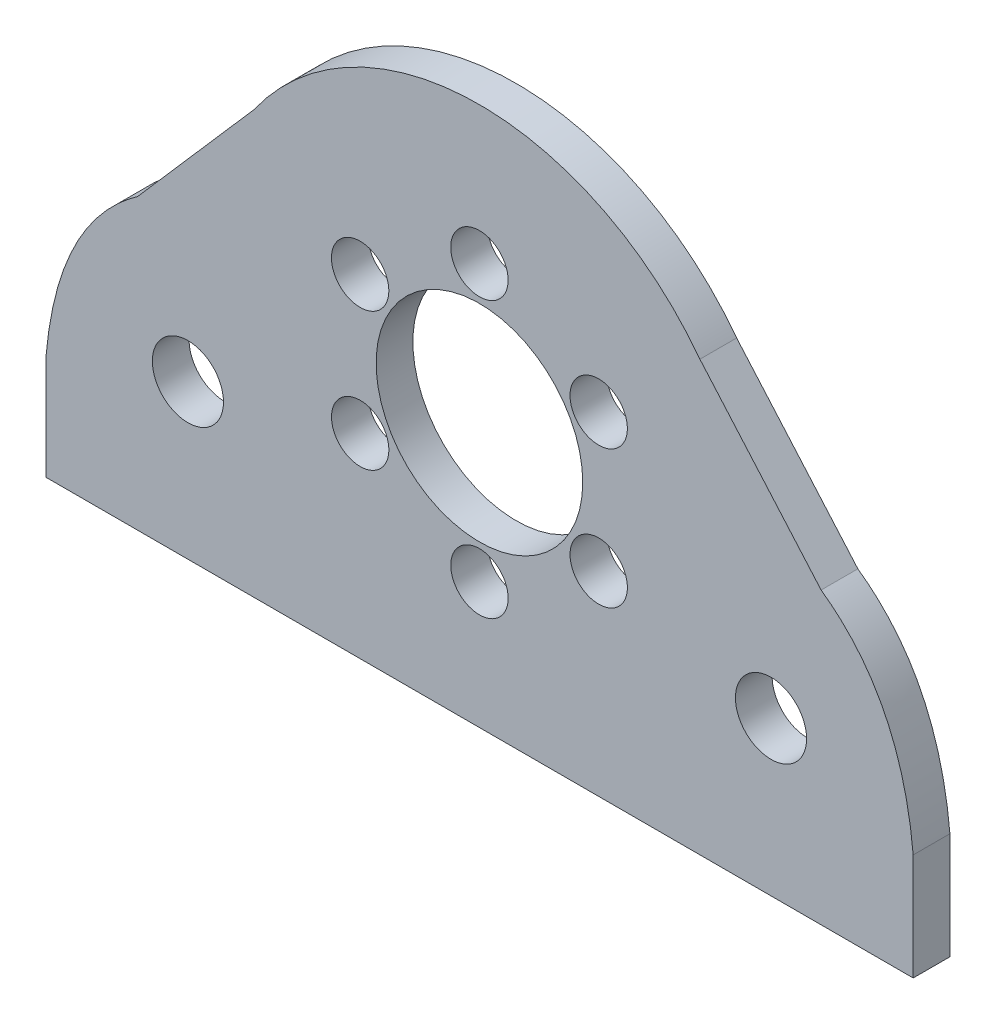
ISO-10303-21;
HEADER;
FILE_DESCRIPTION(('STEP AP214'),'2;1');
FILE_NAME('part.step','',(''),(''),'','','');
FILE_SCHEMA(('AUTOMOTIVE_DESIGN { 1 0 10303 214 1 1 1 1 }'));
ENDSEC;
DATA;
#1=APPLICATION_CONTEXT('core data for automotive mechanical design processes');
#2=APPLICATION_PROTOCOL_DEFINITION('international standard','automotive_design',2000,#1);
#3=PRODUCT_CONTEXT('',#1,'mechanical');
#4=PRODUCT('Part','Part','',(#3));
#5=PRODUCT_RELATED_PRODUCT_CATEGORY('part','',(#4));
#6=PRODUCT_DEFINITION_FORMATION('','',#4);
#7=PRODUCT_DEFINITION_CONTEXT('part definition',#1,'design');
#8=PRODUCT_DEFINITION('design','',#6,#7);
#9=PRODUCT_DEFINITION_SHAPE('','',#8);
#10=(LENGTH_UNIT() NAMED_UNIT(*) SI_UNIT(.MILLI.,.METRE.));
#11=(NAMED_UNIT(*) PLANE_ANGLE_UNIT() SI_UNIT($,.RADIAN.));
#12=(NAMED_UNIT(*) SI_UNIT($,.STERADIAN.) SOLID_ANGLE_UNIT());
#13=UNCERTAINTY_MEASURE_WITH_UNIT(LENGTH_MEASURE(1.E-05),#10,'distance_accuracy_value','');
#14=(GEOMETRIC_REPRESENTATION_CONTEXT(3) GLOBAL_UNCERTAINTY_ASSIGNED_CONTEXT((#13)) GLOBAL_UNIT_ASSIGNED_CONTEXT((#10,
#11,#12)) REPRESENTATION_CONTEXT('',''));
#15=CARTESIAN_POINT('',(0.,0.,0.));
#16=DIRECTION('',(0.,0.,1.));
#17=DIRECTION('',(1.,0.,0.));
#18=AXIS2_PLACEMENT_3D('',#15,#16,#17);
#19=CARTESIAN_POINT('',(18.8920534724066,0.,1.6));
#20=DIRECTION('',(-1.,0.,0.));
#21=DIRECTION('',(0.,0.,1.));
#22=AXIS2_PLACEMENT_3D('',#19,#20,#21);
#23=PLANE('',#22);
#24=DIRECTION('',(0.,1.,0.));
#25=VECTOR('',#24,1.);
#26=CARTESIAN_POINT('',(18.8920534724066,0.,0.));
#27=LINE('',#26,#25);
#28=CARTESIAN_POINT('',(18.8920534724066,-10.5537900070468,0.));
#29=VERTEX_POINT('',#28);
#30=CARTESIAN_POINT('',(18.8920534724066,-5.91094568571899,0.));
#31=VERTEX_POINT('',#30);
#32=EDGE_CURVE('E180',#29,#31,#27,.T.);
#33=ORIENTED_EDGE('',*,*,#32,.T.);
#34=DIRECTION('',(0.,0.,-1.));
#35=VECTOR('',#34,1.);
#36=CARTESIAN_POINT('',(18.8920534724066,-5.91094568571899,1.6));
#37=LINE('',#36,#35);
#38=CARTESIAN_POINT('',(18.8920534724066,-5.91094568571899,1.6));
#39=VERTEX_POINT('',#38);
#40=EDGE_CURVE('E11',#39,#31,#37,.T.);
#41=ORIENTED_EDGE('',*,*,#40,.F.);
#42=DIRECTION('',(0.,1.,0.));
#43=VECTOR('',#42,1.);
#44=CARTESIAN_POINT('',(18.8920534724066,0.,1.6));
#45=LINE('',#44,#43);
#46=CARTESIAN_POINT('',(18.8920534724066,-10.5537900070468,1.6));
#47=VERTEX_POINT('',#46);
#48=EDGE_CURVE('E257',#47,#39,#45,.T.);
#49=ORIENTED_EDGE('',*,*,#48,.F.);
#50=DIRECTION('',(0.,0.,-1.));
#51=VECTOR('',#50,1.);
#52=CARTESIAN_POINT('',(18.8920534724066,-10.5537900070468,1.6));
#53=LINE('',#52,#51);
#54=EDGE_CURVE('E137',#47,#29,#53,.T.);
#55=ORIENTED_EDGE('',*,*,#54,.T.);
#56=EDGE_LOOP('',(#33,#41,#49,#55));
#57=FACE_BOUND('',#56,.T.);
#58=ADVANCED_FACE('F41',(#57),#23,.F.);
#59=CARTESIAN_POINT('',(18.8920534724066,-5.91094568571899,1.6));
#60=CARTESIAN_POINT('',(18.3783475875311,-0.392416565991136,1.6));
#61=CARTESIAN_POINT('',(14.881416044763,2.07387919766717,1.6));
#62=B_SPLINE_CURVE_WITH_KNOTS('',2,(#59,#60,#61),.UNSPECIFIED.,.F.,.F.,(3,3),(0.,
0.73409738211768),.UNSPECIFIED.);
#63=DIRECTION('',(0.,0.,-1.));
#64=VECTOR('',#63,1.);
#65=SURFACE_OF_LINEAR_EXTRUSION('',#62,#64);
#66=CARTESIAN_POINT('',(18.8920534724066,-5.91094568571899,0.));
#67=CARTESIAN_POINT('',(18.3783475875311,-0.392416565991136,0.));
#68=CARTESIAN_POINT('',(14.881416044763,2.07387919766717,0.));
#69=B_SPLINE_CURVE_WITH_KNOTS('',2,(#66,#67,#68),.UNSPECIFIED.,.F.,.F.,(3,3),(0.,
0.73409738211768),.UNSPECIFIED.);
#70=CARTESIAN_POINT('',(14.881416044763,2.07387919766717,0.));
#71=VERTEX_POINT('',#70);
#72=EDGE_CURVE('E184',#31,#71,#69,.T.);
#73=ORIENTED_EDGE('',*,*,#72,.T.);
#74=DIRECTION('',(0.,0.,-1.));
#75=VECTOR('',#74,1.);
#76=CARTESIAN_POINT('',(14.881416044763,2.07387919766717,1.6));
#77=LINE('',#76,#75);
#78=CARTESIAN_POINT('',(14.881416044763,2.07387919766717,1.6));
#79=VERTEX_POINT('',#78);
#80=EDGE_CURVE('E51',#79,#71,#77,.T.);
#81=ORIENTED_EDGE('',*,*,#80,.F.);
#82=EDGE_CURVE('E98',#39,#79,#62,.T.);
#83=ORIENTED_EDGE('',*,*,#82,.F.);
#84=ORIENTED_EDGE('',*,*,#40,.T.);
#85=EDGE_LOOP('',(#73,#81,#83,#84));
#86=FACE_BOUND('',#85,.T.);
#87=ADVANCED_FACE('F263',(#86),#65,.F.);
#88=CARTESIAN_POINT('',(9.49702637729896,8.26265301891822,1.6));
#89=DIRECTION('',(-0.754433634744684,-0.65637633318541,0.));
#90=DIRECTION('',(0.65637633318541,-0.754433634744684,0.));
#91=AXIS2_PLACEMENT_3D('',#88,#89,#90);
#92=PLANE('',#91);
#93=DIRECTION('',(-0.65637633318541,0.754433634744684,0.));
#94=VECTOR('',#93,1.);
#95=CARTESIAN_POINT('',(9.49702637729896,8.26265301891822,0.));
#96=LINE('',#95,#94);
#97=CARTESIAN_POINT('',(9.6016983628083,8.14234388756896,0.));
#98=VERTEX_POINT('',#97);
#99=EDGE_CURVE('E189',#71,#98,#96,.T.);
#100=ORIENTED_EDGE('',*,*,#99,.T.);
#101=DIRECTION('',(0.,0.,-1.));
#102=VECTOR('',#101,1.);
#103=CARTESIAN_POINT('',(9.6016983628083,8.14234388756896,1.6));
#104=LINE('',#103,#102);
#105=CARTESIAN_POINT('',(9.6016983628083,8.14234388756896,1.6));
#106=VERTEX_POINT('',#105);
#107=EDGE_CURVE('E225',#106,#98,#104,.T.);
#108=ORIENTED_EDGE('',*,*,#107,.F.);
#109=DIRECTION('',(-0.65637633318541,0.754433634744684,0.));
#110=VECTOR('',#109,1.);
#111=CARTESIAN_POINT('',(9.49702637729896,8.26265301891822,1.6));
#112=LINE('',#111,#110);
#113=EDGE_CURVE('E235',#79,#106,#112,.T.);
#114=ORIENTED_EDGE('',*,*,#113,.F.);
#115=ORIENTED_EDGE('',*,*,#80,.T.);
#116=EDGE_LOOP('',(#100,#108,#114,#115));
#117=FACE_BOUND('',#116,.T.);
#118=ADVANCED_FACE('F233',(#117),#92,.F.);
#119=CARTESIAN_POINT('',(-0.00120000000012124,0.94620999251001,1.6));
#120=DIRECTION('',(0.,0.,-1.));
#121=DIRECTION('',(-1.,0.,0.));
#122=AXIS2_PLACEMENT_3D('',#119,#120,#121);
#123=CYLINDRICAL_SURFACE('',#122,12.0000000000852);
#124=CARTESIAN_POINT('',(-0.00120000000012124,0.94620999251001,0.));
#125=DIRECTION('',(0.,0.,1.));
#126=DIRECTION('',(1.,0.,0.));
#127=AXIS2_PLACEMENT_3D('',#124,#125,#126);
#128=CIRCLE('',#127,12.0000000000852);
#129=CARTESIAN_POINT('',(-9.81679273195231,7.84940775314908,0.));
#130=VERTEX_POINT('',#129);
#131=EDGE_CURVE('E195',#98,#130,#128,.T.);
#132=ORIENTED_EDGE('',*,*,#131,.T.);
#133=DIRECTION('',(0.,0.,-1.));
#134=VECTOR('',#133,1.);
#135=CARTESIAN_POINT('',(-9.81679273195231,7.84940775314908,1.6));
#136=LINE('',#135,#134);
#137=CARTESIAN_POINT('',(-9.81679273195231,7.84940775314908,1.6));
#138=VERTEX_POINT('',#137);
#139=EDGE_CURVE('E222',#138,#130,#136,.T.);
#140=ORIENTED_EDGE('',*,*,#139,.F.);
#141=CARTESIAN_POINT('',(-0.00120000000012124,0.94620999251001,1.6));
#142=DIRECTION('',(0.,0.,1.));
#143=DIRECTION('',(1.,0.,0.));
#144=AXIS2_PLACEMENT_3D('',#141,#142,#143);
#145=CIRCLE('',#144,12.0000000000852);
#146=EDGE_CURVE('E245',#106,#138,#145,.T.);
#147=ORIENTED_EDGE('',*,*,#146,.F.);
#148=ORIENTED_EDGE('',*,*,#107,.T.);
#149=EDGE_LOOP('',(#132,#140,#147,#148));
#150=FACE_BOUND('',#149,.T.);
#151=ADVANCED_FACE('F243',(#150),#123,.T.);
#152=CARTESIAN_POINT('',(-9.46412899404464,8.25378641515928,1.6));
#153=DIRECTION('',(-0.753654096461741,0.657271255180413,0.));
#154=DIRECTION('',(-0.657271255180413,-0.753654096461741,0.));
#155=AXIS2_PLACEMENT_3D('',#152,#153,#154);
#156=PLANE('',#155);
#157=DIRECTION('',(0.657271255180413,0.753654096461741,0.));
#158=VECTOR('',#157,1.);
#159=CARTESIAN_POINT('',(-9.46412899404464,8.25378641515928,0.));
#160=LINE('',#159,#158);
#161=CARTESIAN_POINT('',(-14.8866284260427,2.03612684496389,0.));
#162=VERTEX_POINT('',#161);
#163=EDGE_CURVE('E199',#162,#130,#160,.T.);
#164=ORIENTED_EDGE('',*,*,#163,.F.);
#165=DIRECTION('',(0.,0.,-1.));
#166=VECTOR('',#165,1.);
#167=CARTESIAN_POINT('',(-14.8866284260427,2.03612684496389,1.6));
#168=LINE('',#167,#166);
#169=CARTESIAN_POINT('',(-14.8866284260427,2.03612684496389,1.6));
#170=VERTEX_POINT('',#169);
#171=EDGE_CURVE('E124',#170,#162,#168,.T.);
#172=ORIENTED_EDGE('',*,*,#171,.F.);
#173=DIRECTION('',(0.657271255180413,0.753654096461741,0.));
#174=VECTOR('',#173,1.);
#175=CARTESIAN_POINT('',(-9.46412899404464,8.25378641515928,1.6));
#176=LINE('',#175,#174);
#177=EDGE_CURVE('E130',#170,#138,#176,.T.);
#178=ORIENTED_EDGE('',*,*,#177,.T.);
#179=ORIENTED_EDGE('',*,*,#139,.T.);
#180=EDGE_LOOP('',(#164,#172,#178,#179));
#181=FACE_BOUND('',#180,.T.);
#182=ADVANCED_FACE('F349',(#181),#156,.T.);
#183=CARTESIAN_POINT('',(-18.8769999969561,-5.95884505745107,1.6));
#184=CARTESIAN_POINT('',(-18.3772931316078,-0.43903071001476,1.6));
#185=CARTESIAN_POINT('',(-14.8866284260427,2.03612684496389,1.6));
#186=B_SPLINE_CURVE_WITH_KNOTS('',2,(#183,#184,#185),.UNSPECIFIED.,.F.,.F.,(3,3),(0.,
0.73409738211768),.UNSPECIFIED.);
#187=DIRECTION('',(0.,0.,-1.));
#188=VECTOR('',#187,1.);
#189=SURFACE_OF_LINEAR_EXTRUSION('',#186,#188);
#190=CARTESIAN_POINT('',(-18.8769999969561,-5.95884505745107,0.));
#191=CARTESIAN_POINT('',(-18.3772931316078,-0.43903071001476,0.));
#192=CARTESIAN_POINT('',(-14.8866284260427,2.03612684496389,0.));
#193=B_SPLINE_CURVE_WITH_KNOTS('',2,(#190,#191,#192),.UNSPECIFIED.,.F.,.F.,(3,3),(0.,
0.73409738211768),.UNSPECIFIED.);
#194=CARTESIAN_POINT('',(-18.8769999969561,-5.95884505745107,0.));
#195=VERTEX_POINT('',#194);
#196=EDGE_CURVE('E118',#195,#162,#193,.T.);
#197=ORIENTED_EDGE('',*,*,#196,.F.);
#198=DIRECTION('',(0.,0.,-1.));
#199=VECTOR('',#198,1.);
#200=CARTESIAN_POINT('',(-18.8769999969561,-5.95884505745107,1.6));
#201=LINE('',#200,#199);
#202=CARTESIAN_POINT('',(-18.8769999969561,-5.95884505745107,1.6));
#203=VERTEX_POINT('',#202);
#204=EDGE_CURVE('E113',#203,#195,#201,.T.);
#205=ORIENTED_EDGE('',*,*,#204,.F.);
#206=EDGE_CURVE('E116',#203,#170,#186,.T.);
#207=ORIENTED_EDGE('',*,*,#206,.T.);
#208=ORIENTED_EDGE('',*,*,#171,.T.);
#209=EDGE_LOOP('',(#197,#205,#207,#208));
#210=FACE_BOUND('',#209,.T.);
#211=ADVANCED_FACE('F115',(#210),#189,.T.);
#212=CARTESIAN_POINT('',(-18.8769999969561,0.,1.6));
#213=DIRECTION('',(-1.,0.,0.));
#214=DIRECTION('',(0.,0.,1.));
#215=AXIS2_PLACEMENT_3D('',#212,#213,#214);
#216=PLANE('',#215);
#217=DIRECTION('',(0.,1.,0.));
#218=VECTOR('',#217,1.);
#219=CARTESIAN_POINT('',(-18.8769999969561,0.,0.));
#220=LINE('',#219,#218);
#221=CARTESIAN_POINT('',(-18.8769999969561,-10.5537900070468,0.));
#222=VERTEX_POINT('',#221);
#223=EDGE_CURVE('E207',#222,#195,#220,.T.);
#224=ORIENTED_EDGE('',*,*,#223,.F.);
#225=DIRECTION('',(0.,0.,-1.));
#226=VECTOR('',#225,1.);
#227=CARTESIAN_POINT('',(-18.8769999969561,-10.5537900070468,1.6));
#228=LINE('',#227,#226);
#229=CARTESIAN_POINT('',(-18.8769999969561,-10.5537900070468,1.6));
#230=VERTEX_POINT('',#229);
#231=EDGE_CURVE('E87',#230,#222,#228,.T.);
#232=ORIENTED_EDGE('',*,*,#231,.F.);
#233=DIRECTION('',(0.,1.,0.));
#234=VECTOR('',#233,1.);
#235=CARTESIAN_POINT('',(-18.8769999969561,0.,1.6));
#236=LINE('',#235,#234);
#237=EDGE_CURVE('E128',#230,#203,#236,.T.);
#238=ORIENTED_EDGE('',*,*,#237,.T.);
#239=ORIENTED_EDGE('',*,*,#204,.T.);
#240=EDGE_LOOP('',(#224,#232,#238,#239));
#241=FACE_BOUND('',#240,.T.);
#242=ADVANCED_FACE('F133',(#241),#216,.T.);
#243=CARTESIAN_POINT('',(-0.00120000000012124,0.94620999251001,1.6));
#244=DIRECTION('',(0.,0.,-1.));
#245=DIRECTION('',(-1.,0.,0.));
#246=AXIS2_PLACEMENT_3D('',#243,#244,#245);
#247=CYLINDRICAL_SURFACE('',#246,4.50000000012904);
#248=CARTESIAN_POINT('',(-0.00120000000012124,0.94620999251001,1.6));
#249=DIRECTION('',(0.,0.,1.));
#250=DIRECTION('',(1.,0.,0.));
#251=AXIS2_PLACEMENT_3D('',#248,#249,#250);
#252=CIRCLE('',#251,4.50000000012904);
#253=CARTESIAN_POINT('',(4.49880000012892,0.94620999251001,1.6));
#254=VERTEX_POINT('',#253);
#255=EDGE_CURVE('E467',#254,#254,#252,.T.);
#256=ORIENTED_EDGE('',*,*,#255,.T.);
#257=EDGE_LOOP('',(#256));
#258=FACE_BOUND('',#257,.T.);
#259=CARTESIAN_POINT('',(-0.00120000000012124,0.94620999251001,0.));
#260=DIRECTION('',(0.,0.,1.));
#261=DIRECTION('',(1.,0.,0.));
#262=AXIS2_PLACEMENT_3D('',#259,#260,#261);
#263=CIRCLE('',#262,4.50000000012904);
#264=CARTESIAN_POINT('',(4.49880000012892,0.94620999251001,0.));
#265=VERTEX_POINT('',#264);
#266=EDGE_CURVE('E176',#265,#265,#263,.T.);
#267=ORIENTED_EDGE('',*,*,#266,.F.);
#268=EDGE_LOOP('',(#267));
#269=FACE_BOUND('',#268,.T.);
#270=ADVANCED_FACE('F271',(#258,#269),#247,.F.);
#271=CARTESIAN_POINT('',(-0.00239999997024294,6.94501000288142,1.6));
#272=DIRECTION('',(0.,0.,-1.));
#273=DIRECTION('',(-1.,0.,0.));
#274=AXIS2_PLACEMENT_3D('',#271,#272,#273);
#275=CYLINDRICAL_SURFACE('',#274,1.24999999706816);
#276=CARTESIAN_POINT('',(-0.00239999997024294,6.94501000288142,1.6));
#277=DIRECTION('',(0.,0.,1.));
#278=DIRECTION('',(1.,0.,0.));
#279=AXIS2_PLACEMENT_3D('',#276,#277,#278);
#280=CIRCLE('',#279,1.24999999706816);
#281=CARTESIAN_POINT('',(1.24759999709792,6.94501000288142,1.6));
#282=VERTEX_POINT('',#281);
#283=EDGE_CURVE('E470',#282,#282,#280,.T.);
#284=ORIENTED_EDGE('',*,*,#283,.T.);
#285=EDGE_LOOP('',(#284));
#286=FACE_BOUND('',#285,.T.);
#287=CARTESIAN_POINT('',(-0.00239999997024294,6.94501000288142,0.));
#288=DIRECTION('',(0.,0.,1.));
#289=DIRECTION('',(1.,0.,0.));
#290=AXIS2_PLACEMENT_3D('',#287,#288,#289);
#291=CIRCLE('',#290,1.24999999706816);
#292=CARTESIAN_POINT('',(1.24759999709792,6.94501000288142,0.));
#293=VERTEX_POINT('',#292);
#294=EDGE_CURVE('E172',#293,#293,#291,.T.);
#295=ORIENTED_EDGE('',*,*,#294,.F.);
#296=EDGE_LOOP('',(#295));
#297=FACE_BOUND('',#296,.T.);
#298=ADVANCED_FACE('F274',(#286,#297),#275,.F.);
#299=CARTESIAN_POINT('',(5.19331319222158,3.94664922343804,1.6));
#300=DIRECTION('',(0.,0.,-1.));
#301=DIRECTION('',(-1.,0.,0.));
#302=AXIS2_PLACEMENT_3D('',#299,#300,#301);
#303=CYLINDRICAL_SURFACE('',#302,1.25000000000009);
#304=CARTESIAN_POINT('',(5.19331319222158,3.94664922343804,1.6));
#305=DIRECTION('',(0.,0.,1.));
#306=DIRECTION('',(1.,0.,0.));
#307=AXIS2_PLACEMENT_3D('',#304,#305,#306);
#308=CIRCLE('',#307,1.25000000000009);
#309=CARTESIAN_POINT('',(6.44331319222167,3.94664922343804,1.6));
#310=VERTEX_POINT('',#309);
#311=EDGE_CURVE('E474',#310,#310,#308,.T.);
#312=ORIENTED_EDGE('',*,*,#311,.T.);
#313=EDGE_LOOP('',(#312));
#314=FACE_BOUND('',#313,.T.);
#315=CARTESIAN_POINT('',(5.19331319222158,3.94664922343804,0.));
#316=DIRECTION('',(0.,0.,1.));
#317=DIRECTION('',(1.,0.,0.));
#318=AXIS2_PLACEMENT_3D('',#315,#316,#317);
#319=CIRCLE('',#318,1.25000000000009);
#320=CARTESIAN_POINT('',(6.44331319222167,3.94664922343804,0.));
#321=VERTEX_POINT('',#320);
#322=EDGE_CURVE('E168',#321,#321,#319,.T.);
#323=ORIENTED_EDGE('',*,*,#322,.F.);
#324=EDGE_LOOP('',(#323));
#325=FACE_BOUND('',#324,.T.);
#326=ADVANCED_FACE('F278',(#314,#325),#303,.F.);
#327=CARTESIAN_POINT('',(5.19451319222192,-2.05215077656196,1.6));
#328=DIRECTION('',(0.,0.,-1.));
#329=DIRECTION('',(-1.,0.,0.));
#330=AXIS2_PLACEMENT_3D('',#327,#328,#329);
#331=CYLINDRICAL_SURFACE('',#330,1.25000000000043);
#332=CARTESIAN_POINT('',(5.19451319222192,-2.05215077656196,1.6));
#333=DIRECTION('',(0.,0.,1.));
#334=DIRECTION('',(1.,0.,0.));
#335=AXIS2_PLACEMENT_3D('',#332,#333,#334);
#336=CIRCLE('',#335,1.25000000000043);
#337=CARTESIAN_POINT('',(6.44451319222235,-2.05215077656196,1.6));
#338=VERTEX_POINT('',#337);
#339=EDGE_CURVE('E480',#338,#338,#336,.T.);
#340=ORIENTED_EDGE('',*,*,#339,.T.);
#341=EDGE_LOOP('',(#340));
#342=FACE_BOUND('',#341,.T.);
#343=CARTESIAN_POINT('',(5.19451319222192,-2.05215077656196,0.));
#344=DIRECTION('',(0.,0.,1.));
#345=DIRECTION('',(1.,0.,0.));
#346=AXIS2_PLACEMENT_3D('',#343,#344,#345);
#347=CIRCLE('',#346,1.25000000000043);
#348=CARTESIAN_POINT('',(6.44451319222235,-2.05215077656196,0.));
#349=VERTEX_POINT('',#348);
#350=EDGE_CURVE('E164',#349,#349,#347,.T.);
#351=ORIENTED_EDGE('',*,*,#350,.F.);
#352=EDGE_LOOP('',(#351));
#353=FACE_BOUND('',#352,.T.);
#354=ADVANCED_FACE('F282',(#342,#353),#331,.F.);
#355=CARTESIAN_POINT('',(0.,-5.0525900070468,1.6));
#356=DIRECTION('',(0.,0.,-1.));
#357=DIRECTION('',(-1.,0.,0.));
#358=AXIS2_PLACEMENT_3D('',#355,#356,#357);
#359=CYLINDRICAL_SURFACE('',#358,1.25000000000069);
#360=CARTESIAN_POINT('',(0.,-5.0525900070468,1.6));
#361=DIRECTION('',(0.,0.,1.));
#362=DIRECTION('',(1.,0.,0.));
#363=AXIS2_PLACEMENT_3D('',#360,#361,#362);
#364=CIRCLE('',#363,1.25000000000069);
#365=CARTESIAN_POINT('',(1.25000000000069,-5.0525900070468,1.6));
#366=VERTEX_POINT('',#365);
#367=EDGE_CURVE('E484',#366,#366,#364,.T.);
#368=ORIENTED_EDGE('',*,*,#367,.T.);
#369=EDGE_LOOP('',(#368));
#370=FACE_BOUND('',#369,.T.);
#371=CARTESIAN_POINT('',(0.,-5.0525900070468,0.));
#372=DIRECTION('',(0.,0.,1.));
#373=DIRECTION('',(1.,0.,0.));
#374=AXIS2_PLACEMENT_3D('',#371,#372,#373);
#375=CIRCLE('',#374,1.25000000000069);
#376=CARTESIAN_POINT('',(1.25000000000069,-5.0525900070468,0.));
#377=VERTEX_POINT('',#376);
#378=EDGE_CURVE('E160',#377,#377,#375,.T.);
#379=ORIENTED_EDGE('',*,*,#378,.F.);
#380=EDGE_LOOP('',(#379));
#381=FACE_BOUND('',#380,.T.);
#382=ADVANCED_FACE('F286',(#370,#381),#359,.F.);
#383=CARTESIAN_POINT('',(-5.19571319222226,-2.05422923753164,1.6));
#384=DIRECTION('',(0.,0.,-1.));
#385=DIRECTION('',(-1.,0.,0.));
#386=AXIS2_PLACEMENT_3D('',#383,#384,#385);
#387=CYLINDRICAL_SURFACE('',#386,1.25000000000063);
#388=CARTESIAN_POINT('',(-5.19571319222226,-2.05422923753164,1.6));
#389=DIRECTION('',(0.,0.,1.));
#390=DIRECTION('',(1.,0.,0.));
#391=AXIS2_PLACEMENT_3D('',#388,#389,#390);
#392=CIRCLE('',#391,1.25000000000063);
#393=CARTESIAN_POINT('',(-3.94571319222163,-2.05422923753164,1.6));
#394=VERTEX_POINT('',#393);
#395=EDGE_CURVE('E488',#394,#394,#392,.T.);
#396=ORIENTED_EDGE('',*,*,#395,.T.);
#397=EDGE_LOOP('',(#396));
#398=FACE_BOUND('',#397,.T.);
#399=CARTESIAN_POINT('',(-5.19571319222226,-2.05422923753164,0.));
#400=DIRECTION('',(0.,0.,1.));
#401=DIRECTION('',(1.,0.,0.));
#402=AXIS2_PLACEMENT_3D('',#399,#400,#401);
#403=CIRCLE('',#402,1.25000000000063);
#404=CARTESIAN_POINT('',(-3.94571319222163,-2.05422923753164,0.));
#405=VERTEX_POINT('',#404);
#406=EDGE_CURVE('E156',#405,#405,#403,.T.);
#407=ORIENTED_EDGE('',*,*,#406,.F.);
#408=EDGE_LOOP('',(#407));
#409=FACE_BOUND('',#408,.T.);
#410=ADVANCED_FACE('F290',(#398,#409),#387,.F.);
#411=CARTESIAN_POINT('',(-5.19691324784471,3.94457079457472,1.6));
#412=DIRECTION('',(0.,0.,-1.));
#413=DIRECTION('',(-1.,0.,0.));
#414=AXIS2_PLACEMENT_3D('',#411,#412,#413);
#415=CYLINDRICAL_SURFACE('',#414,1.25000000660969);
#416=CARTESIAN_POINT('',(-5.19691324784471,3.94457079457472,1.6));
#417=DIRECTION('',(0.,0.,1.));
#418=DIRECTION('',(1.,0.,0.));
#419=AXIS2_PLACEMENT_3D('',#416,#417,#418);
#420=CIRCLE('',#419,1.25000000660969);
#421=CARTESIAN_POINT('',(-3.94691324123502,3.94457079457472,1.6));
#422=VERTEX_POINT('',#421);
#423=EDGE_CURVE('E492',#422,#422,#420,.T.);
#424=ORIENTED_EDGE('',*,*,#423,.T.);
#425=EDGE_LOOP('',(#424));
#426=FACE_BOUND('',#425,.T.);
#427=CARTESIAN_POINT('',(-5.19691324784471,3.94457079457472,0.));
#428=DIRECTION('',(0.,0.,1.));
#429=DIRECTION('',(1.,0.,0.));
#430=AXIS2_PLACEMENT_3D('',#427,#428,#429);
#431=CIRCLE('',#430,1.25000000660969);
#432=CARTESIAN_POINT('',(-3.94691324123502,3.94457079457472,0.));
#433=VERTEX_POINT('',#432);
#434=EDGE_CURVE('E152',#433,#433,#431,.T.);
#435=ORIENTED_EDGE('',*,*,#434,.F.);
#436=EDGE_LOOP('',(#435));
#437=FACE_BOUND('',#436,.T.);
#438=ADVANCED_FACE('F294',(#426,#437),#415,.F.);
#439=CARTESIAN_POINT('',(12.6987999999993,-3.8537900070468,1.6));
#440=DIRECTION('',(0.,0.,-1.));
#441=DIRECTION('',(-1.,0.,0.));
#442=AXIS2_PLACEMENT_3D('',#439,#440,#441);
#443=CYLINDRICAL_SURFACE('',#442,1.55);
#444=CARTESIAN_POINT('',(12.6987999999993,-3.8537900070468,1.6));
#445=DIRECTION('',(0.,0.,1.));
#446=DIRECTION('',(1.,0.,0.));
#447=AXIS2_PLACEMENT_3D('',#444,#445,#446);
#448=CIRCLE('',#447,1.55);
#449=CARTESIAN_POINT('',(14.2487999999993,-3.8537900070468,1.6));
#450=VERTEX_POINT('',#449);
#451=EDGE_CURVE('E309',#450,#450,#448,.T.);
#452=ORIENTED_EDGE('',*,*,#451,.T.);
#453=EDGE_LOOP('',(#452));
#454=FACE_BOUND('',#453,.T.);
#455=CARTESIAN_POINT('',(12.6987999999993,-3.8537900070468,0.));
#456=DIRECTION('',(0.,0.,1.));
#457=DIRECTION('',(1.,0.,0.));
#458=AXIS2_PLACEMENT_3D('',#455,#456,#457);
#459=CIRCLE('',#458,1.55);
#460=CARTESIAN_POINT('',(14.2487999999993,-3.8537900070468,0.));
#461=VERTEX_POINT('',#460);
#462=EDGE_CURVE('E148',#461,#461,#459,.T.);
#463=ORIENTED_EDGE('',*,*,#462,.F.);
#464=EDGE_LOOP('',(#463));
#465=FACE_BOUND('',#464,.T.);
#466=ADVANCED_FACE('F297',(#454,#465),#443,.F.);
#467=CARTESIAN_POINT('',(-12.6987999999993,-3.8537900070468,1.6));
#468=DIRECTION('',(0.,0.,-1.));
#469=DIRECTION('',(-1.,0.,0.));
#470=AXIS2_PLACEMENT_3D('',#467,#468,#469);
#471=CYLINDRICAL_SURFACE('',#470,1.55);
#472=CARTESIAN_POINT('',(-12.6987999999993,-3.8537900070468,1.6));
#473=DIRECTION('',(0.,0.,1.));
#474=DIRECTION('',(1.,0.,0.));
#475=AXIS2_PLACEMENT_3D('',#472,#473,#474);
#476=CIRCLE('',#475,1.55);
#477=CARTESIAN_POINT('',(-11.1487999999993,-3.8537900070468,1.6));
#478=VERTEX_POINT('',#477);
#479=EDGE_CURVE('E215',#478,#478,#476,.F.);
#480=ORIENTED_EDGE('',*,*,#479,.F.);
#481=EDGE_LOOP('',(#480));
#482=FACE_BOUND('',#481,.T.);
#483=CARTESIAN_POINT('',(-12.6987999999993,-3.8537900070468,0.));
#484=DIRECTION('',(0.,0.,1.));
#485=DIRECTION('',(1.,0.,0.));
#486=AXIS2_PLACEMENT_3D('',#483,#484,#485);
#487=CIRCLE('',#486,1.55);
#488=CARTESIAN_POINT('',(-11.1487999999993,-3.8537900070468,0.));
#489=VERTEX_POINT('',#488);
#490=EDGE_CURVE('E144',#489,#489,#487,.F.);
#491=ORIENTED_EDGE('',*,*,#490,.T.);
#492=EDGE_LOOP('',(#491));
#493=FACE_BOUND('',#492,.T.);
#494=ADVANCED_FACE('F43',(#482,#493),#471,.F.);
#495=CARTESIAN_POINT('',(0.,-10.5537900070468,1.6));
#496=DIRECTION('',(0.,1.,0.));
#497=DIRECTION('',(0.,0.,1.));
#498=AXIS2_PLACEMENT_3D('',#495,#496,#497);
#499=PLANE('',#498);
#500=DIRECTION('',(1.,0.,0.));
#501=VECTOR('',#500,1.);
#502=CARTESIAN_POINT('',(0.,-10.5537900070468,0.));
#503=LINE('',#502,#501);
#504=EDGE_CURVE('E90',#222,#29,#503,.T.);
#505=ORIENTED_EDGE('',*,*,#504,.T.);
#506=ORIENTED_EDGE('',*,*,#54,.F.);
#507=DIRECTION('',(1.,0.,0.));
#508=VECTOR('',#507,1.);
#509=CARTESIAN_POINT('',(0.,-10.5537900070468,1.6));
#510=LINE('',#509,#508);
#511=EDGE_CURVE('E59',#230,#47,#510,.T.);
#512=ORIENTED_EDGE('',*,*,#511,.F.);
#513=ORIENTED_EDGE('',*,*,#231,.T.);
#514=EDGE_LOOP('',(#505,#506,#512,#513));
#515=FACE_BOUND('',#514,.T.);
#516=ADVANCED_FACE('F304',(#515),#499,.F.);
#517=CARTESIAN_POINT('',(0.,0.,1.6));
#518=DIRECTION('',(0.,0.,1.));
#519=DIRECTION('',(1.,0.,0.));
#520=AXIS2_PLACEMENT_3D('',#517,#518,#519);
#521=PLANE('',#520);
#522=ORIENTED_EDGE('',*,*,#479,.T.);
#523=EDGE_LOOP('',(#522));
#524=FACE_BOUND('',#523,.T.);
#525=ORIENTED_EDGE('',*,*,#451,.F.);
#526=EDGE_LOOP('',(#525));
#527=FACE_BOUND('',#526,.T.);
#528=ORIENTED_EDGE('',*,*,#423,.F.);
#529=EDGE_LOOP('',(#528));
#530=FACE_BOUND('',#529,.T.);
#531=ORIENTED_EDGE('',*,*,#395,.F.);
#532=EDGE_LOOP('',(#531));
#533=FACE_BOUND('',#532,.T.);
#534=ORIENTED_EDGE('',*,*,#367,.F.);
#535=EDGE_LOOP('',(#534));
#536=FACE_BOUND('',#535,.T.);
#537=ORIENTED_EDGE('',*,*,#339,.F.);
#538=EDGE_LOOP('',(#537));
#539=FACE_BOUND('',#538,.T.);
#540=ORIENTED_EDGE('',*,*,#311,.F.);
#541=EDGE_LOOP('',(#540));
#542=FACE_BOUND('',#541,.T.);
#543=ORIENTED_EDGE('',*,*,#283,.F.);
#544=EDGE_LOOP('',(#543));
#545=FACE_BOUND('',#544,.T.);
#546=ORIENTED_EDGE('',*,*,#255,.F.);
#547=EDGE_LOOP('',(#546));
#548=FACE_BOUND('',#547,.T.);
#549=ORIENTED_EDGE('',*,*,#48,.T.);
#550=ORIENTED_EDGE('',*,*,#82,.T.);
#551=ORIENTED_EDGE('',*,*,#113,.T.);
#552=ORIENTED_EDGE('',*,*,#146,.T.);
#553=ORIENTED_EDGE('',*,*,#177,.F.);
#554=ORIENTED_EDGE('',*,*,#206,.F.);
#555=ORIENTED_EDGE('',*,*,#237,.F.);
#556=ORIENTED_EDGE('',*,*,#511,.T.);
#557=EDGE_LOOP('',(#549,#550,#551,#552,#553,#554,#555,#556));
#558=FACE_BOUND('',#557,.T.);
#559=ADVANCED_FACE('F127',(#524,#527,#530,#533,#536,#539,#542,#545,#548,#558),#521,.T.);
#560=CARTESIAN_POINT('',(0.,0.,0.));
#561=DIRECTION('',(0.,0.,1.));
#562=DIRECTION('',(1.,0.,0.));
#563=AXIS2_PLACEMENT_3D('',#560,#561,#562);
#564=PLANE('',#563);
#565=ORIENTED_EDGE('',*,*,#490,.F.);
#566=EDGE_LOOP('',(#565));
#567=FACE_BOUND('',#566,.T.);
#568=ORIENTED_EDGE('',*,*,#462,.T.);
#569=EDGE_LOOP('',(#568));
#570=FACE_BOUND('',#569,.T.);
#571=ORIENTED_EDGE('',*,*,#434,.T.);
#572=EDGE_LOOP('',(#571));
#573=FACE_BOUND('',#572,.T.);
#574=ORIENTED_EDGE('',*,*,#406,.T.);
#575=EDGE_LOOP('',(#574));
#576=FACE_BOUND('',#575,.T.);
#577=ORIENTED_EDGE('',*,*,#378,.T.);
#578=EDGE_LOOP('',(#577));
#579=FACE_BOUND('',#578,.T.);
#580=ORIENTED_EDGE('',*,*,#350,.T.);
#581=EDGE_LOOP('',(#580));
#582=FACE_BOUND('',#581,.T.);
#583=ORIENTED_EDGE('',*,*,#322,.T.);
#584=EDGE_LOOP('',(#583));
#585=FACE_BOUND('',#584,.T.);
#586=ORIENTED_EDGE('',*,*,#294,.T.);
#587=EDGE_LOOP('',(#586));
#588=FACE_BOUND('',#587,.T.);
#589=ORIENTED_EDGE('',*,*,#266,.T.);
#590=EDGE_LOOP('',(#589));
#591=FACE_BOUND('',#590,.T.);
#592=ORIENTED_EDGE('',*,*,#32,.F.);
#593=ORIENTED_EDGE('',*,*,#504,.F.);
#594=ORIENTED_EDGE('',*,*,#223,.T.);
#595=ORIENTED_EDGE('',*,*,#196,.T.);
#596=ORIENTED_EDGE('',*,*,#163,.T.);
#597=ORIENTED_EDGE('',*,*,#131,.F.);
#598=ORIENTED_EDGE('',*,*,#99,.F.);
#599=ORIENTED_EDGE('',*,*,#72,.F.);
#600=EDGE_LOOP('',(#592,#593,#594,#595,#596,#597,#598,#599));
#601=FACE_BOUND('',#600,.T.);
#602=ADVANCED_FACE('F239',(#567,#570,#573,#576,#579,#582,#585,#588,#591,#601),#564,.F.);
#603=CLOSED_SHELL('',(#58,#87,#118,#151,#182,#211,#242,#270,#298,#326,#354,#382,#410,#438,#466,
#494,#516,#559,#602));
#604=MANIFOLD_SOLID_BREP('B2',#603);
#605=ADVANCED_BREP_SHAPE_REPRESENTATION('',(#18,#604),#14);
#606=SHAPE_DEFINITION_REPRESENTATION(#9,#605);
ENDSEC;
END-ISO-10303-21;
